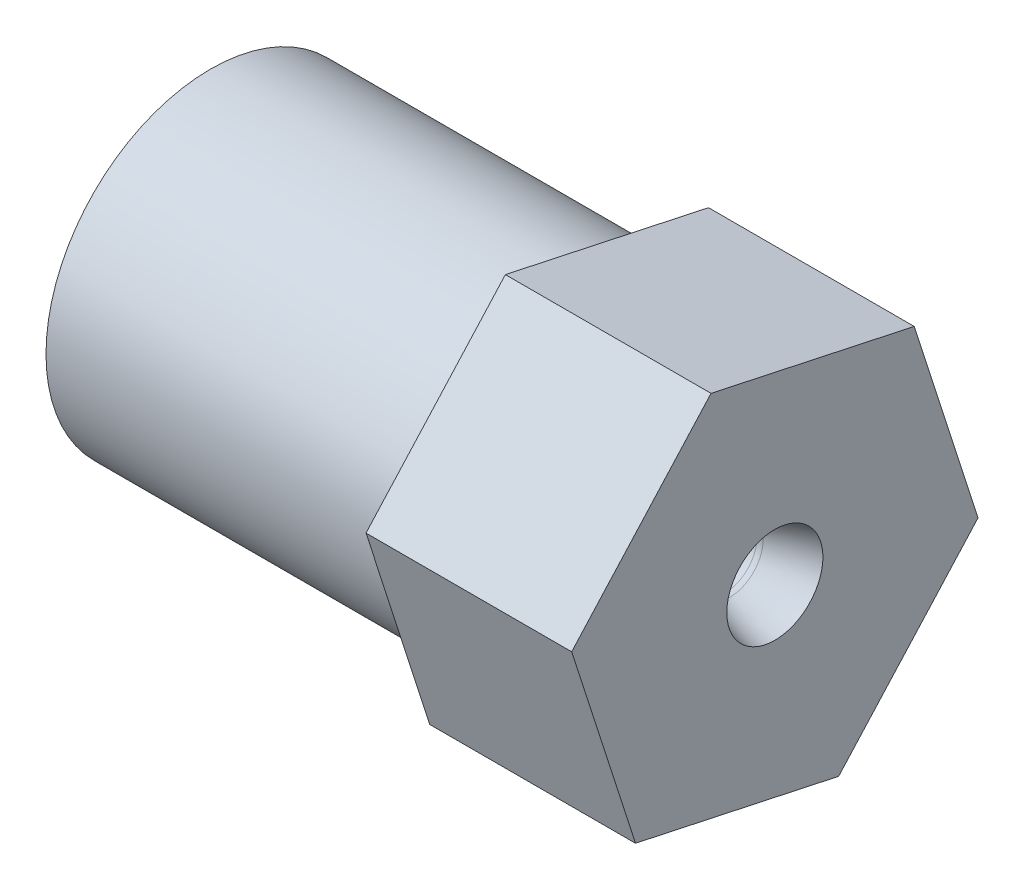
ISO-10303-21;
HEADER;
FILE_DESCRIPTION(('STEP AP214'),'2;1');
FILE_NAME('part.step','',(''),(''),'','','');
FILE_SCHEMA(('AUTOMOTIVE_DESIGN { 1 0 10303 214 1 1 1 1 }'));
ENDSEC;
DATA;
#1=APPLICATION_CONTEXT('core data for automotive mechanical design processes');
#2=APPLICATION_PROTOCOL_DEFINITION('international standard','automotive_design',2000,#1);
#3=PRODUCT_CONTEXT('',#1,'mechanical');
#4=PRODUCT('Part','Part','',(#3));
#5=PRODUCT_RELATED_PRODUCT_CATEGORY('part','',(#4));
#6=PRODUCT_DEFINITION_FORMATION('','',#4);
#7=PRODUCT_DEFINITION_CONTEXT('part definition',#1,'design');
#8=PRODUCT_DEFINITION('design','',#6,#7);
#9=PRODUCT_DEFINITION_SHAPE('','',#8);
#10=(LENGTH_UNIT() NAMED_UNIT(*) SI_UNIT(.MILLI.,.METRE.));
#11=(NAMED_UNIT(*) PLANE_ANGLE_UNIT() SI_UNIT($,.RADIAN.));
#12=(NAMED_UNIT(*) SI_UNIT($,.STERADIAN.) SOLID_ANGLE_UNIT());
#13=UNCERTAINTY_MEASURE_WITH_UNIT(LENGTH_MEASURE(1.E-05),#10,'distance_accuracy_value','');
#14=(GEOMETRIC_REPRESENTATION_CONTEXT(3) GLOBAL_UNCERTAINTY_ASSIGNED_CONTEXT((#13)) GLOBAL_UNIT_ASSIGNED_CONTEXT((#10,
#11,#12)) REPRESENTATION_CONTEXT('',''));
#15=CARTESIAN_POINT('',(0.,0.,0.));
#16=DIRECTION('',(0.,0.,1.));
#17=DIRECTION('',(1.,0.,0.));
#18=AXIS2_PLACEMENT_3D('',#15,#16,#17);
#19=CARTESIAN_POINT('',(0.,0.,0.));
#20=DIRECTION('',(-1.,0.,0.));
#21=DIRECTION('',(0.,0.,1.));
#22=AXIS2_PLACEMENT_3D('',#19,#20,#21);
#23=CYLINDRICAL_SURFACE('',#22,10.16);
#24=CARTESIAN_POINT('',(-10.2372812932457,0.,0.));
#25=DIRECTION('',(1.,0.,0.));
#26=DIRECTION('',(0.,0.,-1.));
#27=AXIS2_PLACEMENT_3D('',#24,#25,#26);
#28=CIRCLE('',#27,10.16);
#29=CARTESIAN_POINT('',(-10.2372812932457,0.,-10.16));
#30=VERTEX_POINT('',#29);
#31=EDGE_CURVE('E11',#30,#30,#28,.F.);
#32=ORIENTED_EDGE('',*,*,#31,.T.);
#33=EDGE_LOOP('',(#32));
#34=FACE_BOUND('',#33,.T.);
#35=CARTESIAN_POINT('',(-31.75,0.,0.));
#36=DIRECTION('',(-1.,0.,0.));
#37=DIRECTION('',(0.,0.,1.));
#38=AXIS2_PLACEMENT_3D('',#35,#36,#37);
#39=CIRCLE('',#38,10.16);
#40=CARTESIAN_POINT('',(-31.75,0.,10.16));
#41=VERTEX_POINT('',#40);
#42=EDGE_CURVE('E225',#41,#41,#39,.T.);
#43=ORIENTED_EDGE('',*,*,#42,.F.);
#44=EDGE_LOOP('',(#43));
#45=FACE_BOUND('',#44,.T.);
#46=ADVANCED_FACE('F37',(#34,#45),#23,.T.);
#47=CARTESIAN_POINT('',(0.,0.,0.));
#48=DIRECTION('',(-1.,0.,0.));
#49=DIRECTION('',(0.,0.,1.));
#50=AXIS2_PLACEMENT_3D('',#47,#48,#49);
#51=TOROIDAL_SURFACE('',#50,5.,3.);
#52=CARTESIAN_POINT('',(0.,0.,0.));
#53=DIRECTION('',(-1.,0.,0.));
#54=DIRECTION('',(0.,0.,1.));
#55=AXIS2_PLACEMENT_3D('',#52,#53,#54);
#56=CIRCLE('',#55,2.00000000000252);
#57=CARTESIAN_POINT('',(0.,0.,2.00000000000252));
#58=VERTEX_POINT('',#57);
#59=EDGE_CURVE('E177',#58,#58,#56,.T.);
#60=ORIENTED_EDGE('',*,*,#59,.F.);
#61=EDGE_LOOP('',(#60));
#62=FACE_BOUND('',#61,.T.);
#63=CARTESIAN_POINT('',(-2.12132034355962,0.,0.));
#64=DIRECTION('',(-1.,0.,0.));
#65=DIRECTION('',(0.,0.,1.));
#66=AXIS2_PLACEMENT_3D('',#63,#64,#65);
#67=CIRCLE('',#66,2.87867965644033);
#68=CARTESIAN_POINT('',(-2.12132034355962,0.,2.87867965644033));
#69=VERTEX_POINT('',#68);
#70=EDGE_CURVE('E142',#69,#69,#67,.T.);
#71=ORIENTED_EDGE('',*,*,#70,.T.);
#72=EDGE_LOOP('',(#71));
#73=FACE_BOUND('',#72,.T.);
#74=ADVANCED_FACE('F166',(#62,#73),#51,.T.);
#75=CARTESIAN_POINT('',(0.,0.,0.));
#76=DIRECTION('',(-1.,0.,0.));
#77=DIRECTION('',(0.,0.,1.));
#78=AXIS2_PLACEMENT_3D('',#75,#76,#77);
#79=TOROIDAL_SURFACE('',#78,2.8,0.799999999997484);
#80=CARTESIAN_POINT('',(0.312584902923518,0.,0.));
#81=DIRECTION('',(-1.,0.,0.));
#82=DIRECTION('',(0.,0.,1.));
#83=AXIS2_PLACEMENT_3D('',#80,#81,#82);
#84=CIRCLE('',#83,2.06359611734608);
#85=CARTESIAN_POINT('',(0.312584902923518,0.,2.06359611734608));
#86=VERTEX_POINT('',#85);
#87=EDGE_CURVE('E231',#86,#86,#84,.T.);
#88=ORIENTED_EDGE('',*,*,#87,.F.);
#89=EDGE_LOOP('',(#88));
#90=FACE_BOUND('',#89,.T.);
#91=ORIENTED_EDGE('',*,*,#59,.T.);
#92=EDGE_LOOP('',(#91));
#93=FACE_BOUND('',#92,.T.);
#94=ADVANCED_FACE('F162',(#90,#93),#79,.T.);
#95=CARTESIAN_POINT('',(385437.078105794,-922750.113604249,0.));
#96=CARTESIAN_POINT('',(-390730.815900652,920506.917050136,0.));
#97=CARTESIAN_POINT('',(396025.804035121,-918255.466111555,0.));
#98=B_SPLINE_CURVE_WITH_KNOTS('',2,(#95,#96,#97),.UNSPECIFIED.,.F.,.F.,(3,3),(0.,1.),.UNSPECIFIED.);
#99=CARTESIAN_POINT('',(0.,0.,0.));
#100=DIRECTION('',(-1.,0.,0.));
#101=AXIS1_PLACEMENT('',#99,#100);
#102=SURFACE_OF_REVOLUTION('',#98,#101);
#103=CARTESIAN_POINT('',(3.09771870675433,0.,0.));
#104=DIRECTION('',(-1.,0.,0.));
#105=DIRECTION('',(0.,0.,1.));
#106=AXIS2_PLACEMENT_3D('',#103,#104,#105);
#107=CIRCLE('',#106,2.96647939483827);
#108=CARTESIAN_POINT('',(3.09771870675433,0.,2.96647939483827));
#109=VERTEX_POINT('',#108);
#110=EDGE_CURVE('E228',#109,#109,#107,.T.);
#111=ORIENTED_EDGE('',*,*,#110,.F.);
#112=EDGE_LOOP('',(#111));
#113=FACE_BOUND('',#112,.T.);
#114=ORIENTED_EDGE('',*,*,#87,.T.);
#115=EDGE_LOOP('',(#114));
#116=FACE_BOUND('',#115,.T.);
#117=ADVANCED_FACE('F157',(#113,#116),#102,.T.);
#118=CARTESIAN_POINT('',(3.09771870675433,10.16,0.));
#119=DIRECTION('',(-1.,0.,0.));
#120=DIRECTION('',(0.,0.,1.));
#121=AXIS2_PLACEMENT_3D('',#118,#119,#120);
#122=PLANE('',#121);
#123=ORIENTED_EDGE('',*,*,#110,.T.);
#124=EDGE_LOOP('',(#123));
#125=FACE_BOUND('',#124,.T.);
#126=DIRECTION('',(0.,-0.951681663898051,-0.307086324345838));
#127=VECTOR('',#126,1.);
#128=CARTESIAN_POINT('',(3.09771870675433,-3.41249677929311,10.575562490067));
#129=LINE('',#128,#127);
#130=CARTESIAN_POINT('',(3.09771870675433,2.69330707117879,12.5457684242006));
#131=VERTEX_POINT('',#130);
#132=CARTESIAN_POINT('',(3.09771870675433,-9.51830062976508,8.60535655593342));
#133=VERTEX_POINT('',#132);
#134=EDGE_CURVE('E125',#131,#133,#129,.T.);
#135=ORIENTED_EDGE('',*,*,#134,.T.);
#136=DIRECTION('',(0.,-0.209896273910743,-0.977723659424475));
#137=VECTOR('',#136,1.);
#138=CARTESIAN_POINT('',(3.09771870675433,-10.8649541653545,2.33247234383313));
#139=LINE('',#138,#137);
#140=CARTESIAN_POINT('',(3.09771870675433,-12.2116077009439,-3.94041186826731));
#141=VERTEX_POINT('',#140);
#142=EDGE_CURVE('E128',#133,#141,#139,.T.);
#143=ORIENTED_EDGE('',*,*,#142,.T.);
#144=DIRECTION('',(0.,0.741785389987309,-0.670637335078637));
#145=VECTOR('',#144,1.);
#146=CARTESIAN_POINT('',(3.09771870675433,-7.45245738606141,-8.24309014623402));
#147=LINE('',#146,#145);
#148=CARTESIAN_POINT('',(3.09771870675433,-2.69330707117886,-12.5457684242008));
#149=VERTEX_POINT('',#148);
#150=EDGE_CURVE('E131',#141,#149,#147,.T.);
#151=ORIENTED_EDGE('',*,*,#150,.T.);
#152=DIRECTION('',(0.,0.951681663898051,0.307086324345838));
#153=VECTOR('',#152,1.);
#154=CARTESIAN_POINT('',(3.09771870675433,3.41249677929314,-10.5755624900671));
#155=LINE('',#154,#153);
#156=CARTESIAN_POINT('',(3.09771870675433,9.51830062976503,-8.60535655593354));
#157=VERTEX_POINT('',#156);
#158=EDGE_CURVE('E134',#149,#157,#155,.T.);
#159=ORIENTED_EDGE('',*,*,#158,.T.);
#160=DIRECTION('',(0.,0.209896273910741,0.977723659424475));
#161=VECTOR('',#160,1.);
#162=CARTESIAN_POINT('',(3.09771870675433,10.8649541653544,-2.3324723438331));
#163=LINE('',#162,#161);
#164=CARTESIAN_POINT('',(3.09771870675433,12.2116077009438,3.94041186826717));
#165=VERTEX_POINT('',#164);
#166=EDGE_CURVE('E102',#157,#165,#163,.T.);
#167=ORIENTED_EDGE('',*,*,#166,.T.);
#168=DIRECTION('',(0.,-0.741785389987308,0.670637335078638));
#169=VECTOR('',#168,1.);
#170=CARTESIAN_POINT('',(3.09771870675433,7.45245738606132,8.2430901462339));
#171=LINE('',#170,#169);
#172=EDGE_CURVE('E137',#165,#131,#171,.T.);
#173=ORIENTED_EDGE('',*,*,#172,.T.);
#174=EDGE_LOOP('',(#135,#143,#151,#159,#167,#173));
#175=FACE_BOUND('',#174,.T.);
#176=ADVANCED_FACE('F161',(#125,#175),#122,.F.);
#177=CARTESIAN_POINT('',(-31.75,10.16,0.));
#178=DIRECTION('',(1.,0.,0.));
#179=DIRECTION('',(0.,0.,-1.));
#180=AXIS2_PLACEMENT_3D('',#177,#178,#179);
#181=PLANE('',#180);
#182=CARTESIAN_POINT('',(-31.75,0.,0.));
#183=DIRECTION('',(-1.,0.,0.));
#184=DIRECTION('',(0.,0.,1.));
#185=AXIS2_PLACEMENT_3D('',#182,#183,#184);
#186=CIRCLE('',#185,8.6614);
#187=CARTESIAN_POINT('',(-31.75,0.,8.6614));
#188=VERTEX_POINT('',#187);
#189=EDGE_CURVE('E222',#188,#188,#186,.T.);
#190=ORIENTED_EDGE('',*,*,#189,.F.);
#191=EDGE_LOOP('',(#190));
#192=FACE_BOUND('',#191,.T.);
#193=ORIENTED_EDGE('',*,*,#42,.T.);
#194=EDGE_LOOP('',(#193));
#195=FACE_BOUND('',#194,.T.);
#196=ADVANCED_FACE('F249',(#192,#195),#181,.F.);
#197=CARTESIAN_POINT('',(-31.115,0.,0.));
#198=DIRECTION('',(-1.,0.,0.));
#199=DIRECTION('',(0.,0.,1.));
#200=AXIS2_PLACEMENT_3D('',#197,#198,#199);
#201=TOROIDAL_SURFACE('',#200,8.6614,0.635);
#202=CARTESIAN_POINT('',(-31.115,0.,0.));
#203=DIRECTION('',(-1.,0.,0.));
#204=DIRECTION('',(0.,0.,1.));
#205=AXIS2_PLACEMENT_3D('',#202,#203,#204);
#206=CIRCLE('',#205,8.02639999999999);
#207=CARTESIAN_POINT('',(-31.115,0.,8.02639999999999));
#208=VERTEX_POINT('',#207);
#209=EDGE_CURVE('E219',#208,#208,#206,.T.);
#210=ORIENTED_EDGE('',*,*,#209,.F.);
#211=EDGE_LOOP('',(#210));
#212=FACE_BOUND('',#211,.T.);
#213=ORIENTED_EDGE('',*,*,#189,.T.);
#214=EDGE_LOOP('',(#213));
#215=FACE_BOUND('',#214,.T.);
#216=ADVANCED_FACE('F251',(#212,#215),#201,.T.);
#217=CARTESIAN_POINT('',(0.,0.,0.));
#218=DIRECTION('',(-1.,0.,0.));
#219=DIRECTION('',(0.,0.,1.));
#220=AXIS2_PLACEMENT_3D('',#217,#218,#219);
#221=CYLINDRICAL_SURFACE('',#220,8.02639999999999);
#222=CARTESIAN_POINT('',(-25.019,0.,0.));
#223=DIRECTION('',(-1.,0.,0.));
#224=DIRECTION('',(0.,0.,1.));
#225=AXIS2_PLACEMENT_3D('',#222,#223,#224);
#226=CIRCLE('',#225,8.02639999999999);
#227=CARTESIAN_POINT('',(-25.019,0.,8.02639999999999));
#228=VERTEX_POINT('',#227);
#229=EDGE_CURVE('E216',#228,#228,#226,.T.);
#230=ORIENTED_EDGE('',*,*,#229,.F.);
#231=EDGE_LOOP('',(#230));
#232=FACE_BOUND('',#231,.T.);
#233=ORIENTED_EDGE('',*,*,#209,.T.);
#234=EDGE_LOOP('',(#233));
#235=FACE_BOUND('',#234,.T.);
#236=ADVANCED_FACE('F258',(#232,#235),#221,.F.);
#237=CARTESIAN_POINT('',(-25.019,0.,0.));
#238=DIRECTION('',(-1.,0.,0.));
#239=DIRECTION('',(0.,0.,1.));
#240=AXIS2_PLACEMENT_3D('',#237,#238,#239);
#241=TOROIDAL_SURFACE('',#240,7.89939999999999,0.127);
#242=CARTESIAN_POINT('',(-24.892,0.,0.));
#243=DIRECTION('',(-1.,0.,0.));
#244=DIRECTION('',(0.,0.,1.));
#245=AXIS2_PLACEMENT_3D('',#242,#243,#244);
#246=CIRCLE('',#245,7.89939999999999);
#247=CARTESIAN_POINT('',(-24.892,0.,7.89939999999999));
#248=VERTEX_POINT('',#247);
#249=EDGE_CURVE('E213',#248,#248,#246,.T.);
#250=ORIENTED_EDGE('',*,*,#249,.F.);
#251=EDGE_LOOP('',(#250));
#252=FACE_BOUND('',#251,.T.);
#253=ORIENTED_EDGE('',*,*,#229,.T.);
#254=EDGE_LOOP('',(#253));
#255=FACE_BOUND('',#254,.T.);
#256=ADVANCED_FACE('F266',(#252,#255),#241,.F.);
#257=CARTESIAN_POINT('',(-24.892,6.9469,0.));
#258=DIRECTION('',(1.,0.,0.));
#259=DIRECTION('',(0.,0.,-1.));
#260=AXIS2_PLACEMENT_3D('',#257,#258,#259);
#261=PLANE('',#260);
#262=CARTESIAN_POINT('',(-24.892,0.,0.));
#263=DIRECTION('',(-1.,0.,0.));
#264=DIRECTION('',(0.,0.,1.));
#265=AXIS2_PLACEMENT_3D('',#262,#263,#264);
#266=CIRCLE('',#265,6.9469);
#267=CARTESIAN_POINT('',(-24.892,0.,6.9469));
#268=VERTEX_POINT('',#267);
#269=EDGE_CURVE('E210',#268,#268,#266,.T.);
#270=ORIENTED_EDGE('',*,*,#269,.F.);
#271=EDGE_LOOP('',(#270));
#272=FACE_BOUND('',#271,.T.);
#273=ORIENTED_EDGE('',*,*,#249,.T.);
#274=EDGE_LOOP('',(#273));
#275=FACE_BOUND('',#274,.T.);
#276=ADVANCED_FACE('F270',(#272,#275),#261,.F.);
#277=CARTESIAN_POINT('',(0.,0.,0.));
#278=DIRECTION('',(-1.,0.,0.));
#279=DIRECTION('',(0.,0.,1.));
#280=AXIS2_PLACEMENT_3D('',#277,#278,#279);
#281=CYLINDRICAL_SURFACE('',#280,6.9469);
#282=CARTESIAN_POINT('',(-20.066,0.,0.));
#283=DIRECTION('',(-1.,0.,0.));
#284=DIRECTION('',(0.,0.,1.));
#285=AXIS2_PLACEMENT_3D('',#282,#283,#284);
#286=CIRCLE('',#285,6.9469);
#287=CARTESIAN_POINT('',(-20.066,0.,6.9469));
#288=VERTEX_POINT('',#287);
#289=EDGE_CURVE('E207',#288,#288,#286,.T.);
#290=ORIENTED_EDGE('',*,*,#289,.F.);
#291=EDGE_LOOP('',(#290));
#292=FACE_BOUND('',#291,.T.);
#293=ORIENTED_EDGE('',*,*,#269,.T.);
#294=EDGE_LOOP('',(#293));
#295=FACE_BOUND('',#294,.T.);
#296=ADVANCED_FACE('F274',(#292,#295),#281,.F.);
#297=CARTESIAN_POINT('',(-20.066,0.,0.));
#298=DIRECTION('',(-1.,0.,0.));
#299=DIRECTION('',(0.,0.,1.));
#300=AXIS2_PLACEMENT_3D('',#297,#298,#299);
#301=TOROIDAL_SURFACE('',#300,6.8199,0.127);
#302=CARTESIAN_POINT('',(-19.939,0.,0.));
#303=DIRECTION('',(-1.,0.,0.));
#304=DIRECTION('',(0.,0.,1.));
#305=AXIS2_PLACEMENT_3D('',#302,#303,#304);
#306=CIRCLE('',#305,6.8199);
#307=CARTESIAN_POINT('',(-19.939,0.,6.8199));
#308=VERTEX_POINT('',#307);
#309=EDGE_CURVE('E204',#308,#308,#306,.T.);
#310=ORIENTED_EDGE('',*,*,#309,.F.);
#311=EDGE_LOOP('',(#310));
#312=FACE_BOUND('',#311,.T.);
#313=ORIENTED_EDGE('',*,*,#289,.T.);
#314=EDGE_LOOP('',(#313));
#315=FACE_BOUND('',#314,.T.);
#316=ADVANCED_FACE('F278',(#312,#315),#301,.F.);
#317=CARTESIAN_POINT('',(-19.939,5.46100000000001,0.));
#318=DIRECTION('',(1.,0.,0.));
#319=DIRECTION('',(0.,0.,-1.));
#320=AXIS2_PLACEMENT_3D('',#317,#318,#319);
#321=PLANE('',#320);
#322=CARTESIAN_POINT('',(-19.939,0.,0.));
#323=DIRECTION('',(-1.,0.,0.));
#324=DIRECTION('',(0.,0.,1.));
#325=AXIS2_PLACEMENT_3D('',#322,#323,#324);
#326=CIRCLE('',#325,5.46100000000001);
#327=CARTESIAN_POINT('',(-19.939,0.,5.46100000000001));
#328=VERTEX_POINT('',#327);
#329=EDGE_CURVE('E201',#328,#328,#326,.T.);
#330=ORIENTED_EDGE('',*,*,#329,.F.);
#331=EDGE_LOOP('',(#330));
#332=FACE_BOUND('',#331,.T.);
#333=ORIENTED_EDGE('',*,*,#309,.T.);
#334=EDGE_LOOP('',(#333));
#335=FACE_BOUND('',#334,.T.);
#336=ADVANCED_FACE('F282',(#332,#335),#321,.F.);
#337=CARTESIAN_POINT('',(-19.304,0.,0.));
#338=DIRECTION('',(-1.,0.,0.));
#339=DIRECTION('',(0.,0.,1.));
#340=AXIS2_PLACEMENT_3D('',#337,#338,#339);
#341=TOROIDAL_SURFACE('',#340,5.461,0.635);
#342=CARTESIAN_POINT('',(-19.304,0.,0.));
#343=DIRECTION('',(-1.,0.,0.));
#344=DIRECTION('',(0.,0.,1.));
#345=AXIS2_PLACEMENT_3D('',#342,#343,#344);
#346=CIRCLE('',#345,4.826);
#347=CARTESIAN_POINT('',(-19.304,0.,4.826));
#348=VERTEX_POINT('',#347);
#349=EDGE_CURVE('E198',#348,#348,#346,.T.);
#350=ORIENTED_EDGE('',*,*,#349,.F.);
#351=EDGE_LOOP('',(#350));
#352=FACE_BOUND('',#351,.T.);
#353=ORIENTED_EDGE('',*,*,#329,.T.);
#354=EDGE_LOOP('',(#353));
#355=FACE_BOUND('',#354,.T.);
#356=ADVANCED_FACE('F286',(#352,#355),#341,.T.);
#357=CARTESIAN_POINT('',(0.,0.,0.));
#358=DIRECTION('',(-1.,0.,0.));
#359=DIRECTION('',(0.,0.,1.));
#360=AXIS2_PLACEMENT_3D('',#357,#358,#359);
#361=CYLINDRICAL_SURFACE('',#360,4.826);
#362=CARTESIAN_POINT('',(-13.589,0.,0.));
#363=DIRECTION('',(-1.,0.,0.));
#364=DIRECTION('',(0.,0.,1.));
#365=AXIS2_PLACEMENT_3D('',#362,#363,#364);
#366=CIRCLE('',#365,4.826);
#367=CARTESIAN_POINT('',(-13.589,0.,4.826));
#368=VERTEX_POINT('',#367);
#369=EDGE_CURVE('E195',#368,#368,#366,.T.);
#370=ORIENTED_EDGE('',*,*,#369,.F.);
#371=EDGE_LOOP('',(#370));
#372=FACE_BOUND('',#371,.T.);
#373=ORIENTED_EDGE('',*,*,#349,.T.);
#374=EDGE_LOOP('',(#373));
#375=FACE_BOUND('',#374,.T.);
#376=ADVANCED_FACE('F290',(#372,#375),#361,.F.);
#377=CARTESIAN_POINT('',(-13.589,0.,0.));
#378=DIRECTION('',(-1.,0.,0.));
#379=DIRECTION('',(0.,0.,1.));
#380=AXIS2_PLACEMENT_3D('',#377,#378,#379);
#381=TOROIDAL_SURFACE('',#380,4.699,0.127);
#382=CARTESIAN_POINT('',(-13.462,0.,0.));
#383=DIRECTION('',(-1.,0.,0.));
#384=DIRECTION('',(0.,0.,1.));
#385=AXIS2_PLACEMENT_3D('',#382,#383,#384);
#386=CIRCLE('',#385,4.699);
#387=CARTESIAN_POINT('',(-13.462,0.,4.699));
#388=VERTEX_POINT('',#387);
#389=EDGE_CURVE('E192',#388,#388,#386,.T.);
#390=ORIENTED_EDGE('',*,*,#389,.F.);
#391=EDGE_LOOP('',(#390));
#392=FACE_BOUND('',#391,.T.);
#393=ORIENTED_EDGE('',*,*,#369,.T.);
#394=EDGE_LOOP('',(#393));
#395=FACE_BOUND('',#394,.T.);
#396=ADVANCED_FACE('F294',(#392,#395),#381,.F.);
#397=CARTESIAN_POINT('',(-13.462,4.445,0.));
#398=DIRECTION('',(1.,0.,0.));
#399=DIRECTION('',(0.,0.,-1.));
#400=AXIS2_PLACEMENT_3D('',#397,#398,#399);
#401=PLANE('',#400);
#402=CARTESIAN_POINT('',(-13.462,0.,0.));
#403=DIRECTION('',(-1.,0.,0.));
#404=DIRECTION('',(0.,0.,1.));
#405=AXIS2_PLACEMENT_3D('',#402,#403,#404);
#406=CIRCLE('',#405,4.445);
#407=CARTESIAN_POINT('',(-13.462,0.,4.445));
#408=VERTEX_POINT('',#407);
#409=EDGE_CURVE('E187',#408,#408,#406,.T.);
#410=ORIENTED_EDGE('',*,*,#409,.F.);
#411=EDGE_LOOP('',(#410));
#412=FACE_BOUND('',#411,.T.);
#413=ORIENTED_EDGE('',*,*,#389,.T.);
#414=EDGE_LOOP('',(#413));
#415=FACE_BOUND('',#414,.T.);
#416=ADVANCED_FACE('F298',(#412,#415),#401,.F.);
#417=CARTESIAN_POINT('',(0.,0.,0.));
#418=DIRECTION('',(-1.,0.,0.));
#419=DIRECTION('',(0.,0.,1.));
#420=AXIS2_PLACEMENT_3D('',#417,#418,#419);
#421=CYLINDRICAL_SURFACE('',#420,4.445);
#422=CARTESIAN_POINT('',(-5.00276874765388,0.,0.));
#423=DIRECTION('',(-1.,0.,0.));
#424=DIRECTION('',(0.,0.,1.));
#425=AXIS2_PLACEMENT_3D('',#422,#423,#424);
#426=CIRCLE('',#425,4.445);
#427=CARTESIAN_POINT('',(-5.00276874765388,0.,4.445));
#428=VERTEX_POINT('',#427);
#429=EDGE_CURVE('E183',#428,#428,#426,.T.);
#430=ORIENTED_EDGE('',*,*,#429,.F.);
#431=EDGE_LOOP('',(#430));
#432=FACE_BOUND('',#431,.T.);
#433=ORIENTED_EDGE('',*,*,#409,.T.);
#434=EDGE_LOOP('',(#433));
#435=FACE_BOUND('',#434,.T.);
#436=ADVANCED_FACE('F302',(#432,#435),#421,.F.);
#437=CARTESIAN_POINT('',(-5.00276874765387,0.,0.));
#438=DIRECTION('',(-1.,0.,0.));
#439=DIRECTION('',(0.,0.,1.));
#440=AXIS2_PLACEMENT_3D('',#437,#438,#439);
#441=DEGENERATE_TOROIDAL_SURFACE('',#440,1.27,3.175,.T.);
#442=CARTESIAN_POINT('',(-2.75770471738661,0.,0.));
#443=DIRECTION('',(-1.,0.,0.));
#444=DIRECTION('',(0.,0.,1.));
#445=AXIS2_PLACEMENT_3D('',#442,#443,#444);
#446=CIRCLE('',#445,3.51506403026731);
#447=CARTESIAN_POINT('',(-2.75770471738661,0.,3.51506403026731));
#448=VERTEX_POINT('',#447);
#449=EDGE_CURVE('E181',#448,#448,#446,.T.);
#450=ORIENTED_EDGE('',*,*,#449,.F.);
#451=EDGE_LOOP('',(#450));
#452=FACE_BOUND('',#451,.T.);
#453=ORIENTED_EDGE('',*,*,#429,.T.);
#454=EDGE_LOOP('',(#453));
#455=FACE_BOUND('',#454,.T.);
#456=ADVANCED_FACE('F306',(#452,#455),#441,.F.);
#457=CARTESIAN_POINT('',(-2.75770471738661,0.,0.));
#458=DIRECTION('',(-1.,0.,0.));
#459=DIRECTION('',(0.,0.,1.));
#460=AXIS2_PLACEMENT_3D('',#457,#458,#459);
#461=CONICAL_SURFACE('',#460,3.51506403026731,0.785398163397435);
#462=ORIENTED_EDGE('',*,*,#70,.F.);
#463=EDGE_LOOP('',(#462));
#464=FACE_BOUND('',#463,.T.);
#465=ORIENTED_EDGE('',*,*,#449,.T.);
#466=EDGE_LOOP('',(#465));
#467=FACE_BOUND('',#466,.T.);
#468=ADVANCED_FACE('F310',(#464,#467),#461,.F.);
#469=CARTESIAN_POINT('',(-9.60228129324567,-3.41249677929311,10.575562490067));
#470=DIRECTION('',(0.,-0.307086324345838,0.951681663898051));
#471=DIRECTION('',(0.,-0.951681663898051,-0.307086324345838));
#472=AXIS2_PLACEMENT_3D('',#469,#470,#471);
#473=PLANE('',#472);
#474=ORIENTED_EDGE('',*,*,#134,.F.);
#475=DIRECTION('',(1.,0.,0.));
#476=VECTOR('',#475,1.);
#477=CARTESIAN_POINT('',(-9.60228129324567,2.69330707117879,12.5457684242006));
#478=LINE('',#477,#476);
#479=CARTESIAN_POINT('',(-9.60228129324567,2.69330707117879,12.5457684242006));
#480=VERTEX_POINT('',#479);
#481=EDGE_CURVE('E54',#480,#131,#478,.T.);
#482=ORIENTED_EDGE('',*,*,#481,.F.);
#483=DIRECTION('',(0.,-0.951681663898051,-0.307086324345838));
#484=VECTOR('',#483,1.);
#485=CARTESIAN_POINT('',(-9.60228129324567,-3.41249677929311,10.575562490067));
#486=LINE('',#485,#484);
#487=CARTESIAN_POINT('',(-9.60228129324567,-9.51830062976508,8.60535655593342));
#488=VERTEX_POINT('',#487);
#489=EDGE_CURVE('E140',#480,#488,#486,.T.);
#490=ORIENTED_EDGE('',*,*,#489,.T.);
#491=DIRECTION('',(1.,0.,0.));
#492=VECTOR('',#491,1.);
#493=CARTESIAN_POINT('',(-9.60228129324567,-9.51830062976508,8.60535655593342));
#494=LINE('',#493,#492);
#495=EDGE_CURVE('E89',#488,#133,#494,.T.);
#496=ORIENTED_EDGE('',*,*,#495,.T.);
#497=EDGE_LOOP('',(#474,#482,#490,#496));
#498=FACE_BOUND('',#497,.T.);
#499=ADVANCED_FACE('F314',(#498),#473,.T.);
#500=CARTESIAN_POINT('',(-9.60228129324567,7.45245738606132,8.2430901462339));
#501=DIRECTION('',(0.,0.670637335078638,0.741785389987308));
#502=DIRECTION('',(0.,-0.741785389987308,0.670637335078638));
#503=AXIS2_PLACEMENT_3D('',#500,#501,#502);
#504=PLANE('',#503);
#505=ORIENTED_EDGE('',*,*,#172,.F.);
#506=DIRECTION('',(1.,0.,0.));
#507=VECTOR('',#506,1.);
#508=CARTESIAN_POINT('',(-9.60228129324567,12.2116077009438,3.94041186826717));
#509=LINE('',#508,#507);
#510=CARTESIAN_POINT('',(-9.60228129324567,12.2116077009438,3.94041186826717));
#511=VERTEX_POINT('',#510);
#512=EDGE_CURVE('E77',#511,#165,#509,.T.);
#513=ORIENTED_EDGE('',*,*,#512,.F.);
#514=DIRECTION('',(0.,-0.741785389987308,0.670637335078638));
#515=VECTOR('',#514,1.);
#516=CARTESIAN_POINT('',(-9.60228129324567,7.45245738606132,8.2430901462339));
#517=LINE('',#516,#515);
#518=EDGE_CURVE('E115',#511,#480,#517,.T.);
#519=ORIENTED_EDGE('',*,*,#518,.T.);
#520=ORIENTED_EDGE('',*,*,#481,.T.);
#521=EDGE_LOOP('',(#505,#513,#519,#520));
#522=FACE_BOUND('',#521,.T.);
#523=ADVANCED_FACE('F317',(#522),#504,.T.);
#524=CARTESIAN_POINT('',(-9.60228129324567,10.8649541653544,-2.3324723438331));
#525=DIRECTION('',(0.,0.977723659424475,-0.209896273910741));
#526=DIRECTION('',(0.,0.209896273910741,0.977723659424475));
#527=AXIS2_PLACEMENT_3D('',#524,#525,#526);
#528=PLANE('',#527);
#529=ORIENTED_EDGE('',*,*,#166,.F.);
#530=DIRECTION('',(1.,0.,0.));
#531=VECTOR('',#530,1.);
#532=CARTESIAN_POINT('',(-9.60228129324567,9.51830062976503,-8.60535655593354));
#533=LINE('',#532,#531);
#534=CARTESIAN_POINT('',(-9.60228129324567,9.51830062976503,-8.60535655593354));
#535=VERTEX_POINT('',#534);
#536=EDGE_CURVE('E97',#535,#157,#533,.T.);
#537=ORIENTED_EDGE('',*,*,#536,.F.);
#538=DIRECTION('',(0.,0.209896273910741,0.977723659424475));
#539=VECTOR('',#538,1.);
#540=CARTESIAN_POINT('',(-9.60228129324567,10.8649541653544,-2.3324723438331));
#541=LINE('',#540,#539);
#542=EDGE_CURVE('E100',#535,#511,#541,.T.);
#543=ORIENTED_EDGE('',*,*,#542,.T.);
#544=ORIENTED_EDGE('',*,*,#512,.T.);
#545=EDGE_LOOP('',(#529,#537,#543,#544));
#546=FACE_BOUND('',#545,.T.);
#547=ADVANCED_FACE('F99',(#546),#528,.T.);
#548=CARTESIAN_POINT('',(-9.60228129324567,3.41249677929314,-10.5755624900671));
#549=DIRECTION('',(0.,0.307086324345838,-0.951681663898051));
#550=DIRECTION('',(0.,0.951681663898051,0.307086324345838));
#551=AXIS2_PLACEMENT_3D('',#548,#549,#550);
#552=PLANE('',#551);
#553=ORIENTED_EDGE('',*,*,#158,.F.);
#554=DIRECTION('',(1.,0.,0.));
#555=VECTOR('',#554,1.);
#556=CARTESIAN_POINT('',(-9.60228129324567,-2.69330707117886,-12.5457684242008));
#557=LINE('',#556,#555);
#558=CARTESIAN_POINT('',(-9.60228129324567,-2.69330707117886,-12.5457684242008));
#559=VERTEX_POINT('',#558);
#560=EDGE_CURVE('E107',#559,#149,#557,.T.);
#561=ORIENTED_EDGE('',*,*,#560,.F.);
#562=DIRECTION('',(0.,0.951681663898051,0.307086324345838));
#563=VECTOR('',#562,1.);
#564=CARTESIAN_POINT('',(-9.60228129324567,3.41249677929314,-10.5755624900671));
#565=LINE('',#564,#563);
#566=EDGE_CURVE('E113',#559,#535,#565,.T.);
#567=ORIENTED_EDGE('',*,*,#566,.T.);
#568=ORIENTED_EDGE('',*,*,#536,.T.);
#569=EDGE_LOOP('',(#553,#561,#567,#568));
#570=FACE_BOUND('',#569,.T.);
#571=ADVANCED_FACE('F117',(#570),#552,.T.);
#572=CARTESIAN_POINT('',(-9.60228129324567,-7.45245738606141,-8.24309014623402));
#573=DIRECTION('',(0.,-0.670637335078637,-0.741785389987309));
#574=DIRECTION('',(0.,0.741785389987309,-0.670637335078637));
#575=AXIS2_PLACEMENT_3D('',#572,#573,#574);
#576=PLANE('',#575);
#577=ORIENTED_EDGE('',*,*,#150,.F.);
#578=DIRECTION('',(1.,0.,0.));
#579=VECTOR('',#578,1.);
#580=CARTESIAN_POINT('',(-9.60228129324567,-12.2116077009439,-3.94041186826731));
#581=LINE('',#580,#579);
#582=CARTESIAN_POINT('',(-9.60228129324567,-12.2116077009439,-3.94041186826731));
#583=VERTEX_POINT('',#582);
#584=EDGE_CURVE('E145',#583,#141,#581,.T.);
#585=ORIENTED_EDGE('',*,*,#584,.F.);
#586=DIRECTION('',(0.,0.741785389987309,-0.670637335078637));
#587=VECTOR('',#586,1.);
#588=CARTESIAN_POINT('',(-9.60228129324567,-7.45245738606141,-8.24309014623402));
#589=LINE('',#588,#587);
#590=EDGE_CURVE('E118',#583,#559,#589,.T.);
#591=ORIENTED_EDGE('',*,*,#590,.T.);
#592=ORIENTED_EDGE('',*,*,#560,.T.);
#593=EDGE_LOOP('',(#577,#585,#591,#592));
#594=FACE_BOUND('',#593,.T.);
#595=ADVANCED_FACE('F320',(#594),#576,.T.);
#596=CARTESIAN_POINT('',(-9.60228129324567,-10.8649541653545,2.33247234383313));
#597=DIRECTION('',(0.,-0.977723659424475,0.209896273910743));
#598=DIRECTION('',(0.,-0.209896273910743,-0.977723659424475));
#599=AXIS2_PLACEMENT_3D('',#596,#597,#598);
#600=PLANE('',#599);
#601=ORIENTED_EDGE('',*,*,#142,.F.);
#602=ORIENTED_EDGE('',*,*,#495,.F.);
#603=DIRECTION('',(0.,-0.209896273910743,-0.977723659424475));
#604=VECTOR('',#603,1.);
#605=CARTESIAN_POINT('',(-9.60228129324567,-10.8649541653545,2.33247234383313));
#606=LINE('',#605,#604);
#607=EDGE_CURVE('E120',#488,#583,#606,.T.);
#608=ORIENTED_EDGE('',*,*,#607,.T.);
#609=ORIENTED_EDGE('',*,*,#584,.T.);
#610=EDGE_LOOP('',(#601,#602,#608,#609));
#611=FACE_BOUND('',#610,.T.);
#612=ADVANCED_FACE('F243',(#611),#600,.T.);
#613=CARTESIAN_POINT('',(-9.60228129324567,0.,0.));
#614=DIRECTION('',(1.,0.,0.));
#615=DIRECTION('',(0.,0.,-1.));
#616=AXIS2_PLACEMENT_3D('',#613,#614,#615);
#617=PLANE('',#616);
#618=CARTESIAN_POINT('',(-9.60228129324567,0.,0.));
#619=DIRECTION('',(1.,0.,0.));
#620=DIRECTION('',(0.,0.,-1.));
#621=AXIS2_PLACEMENT_3D('',#618,#619,#620);
#622=CIRCLE('',#621,10.795);
#623=CARTESIAN_POINT('',(-9.60228129324567,0.,-10.795));
#624=VERTEX_POINT('',#623);
#625=EDGE_CURVE('E46',#624,#624,#622,.T.);
#626=ORIENTED_EDGE('',*,*,#625,.T.);
#627=EDGE_LOOP('',(#626));
#628=FACE_BOUND('',#627,.T.);
#629=ORIENTED_EDGE('',*,*,#489,.F.);
#630=ORIENTED_EDGE('',*,*,#518,.F.);
#631=ORIENTED_EDGE('',*,*,#542,.F.);
#632=ORIENTED_EDGE('',*,*,#566,.F.);
#633=ORIENTED_EDGE('',*,*,#590,.F.);
#634=ORIENTED_EDGE('',*,*,#607,.F.);
#635=EDGE_LOOP('',(#629,#630,#631,#632,#633,#634));
#636=FACE_BOUND('',#635,.T.);
#637=ADVANCED_FACE('F111',(#628,#636),#617,.F.);
#638=CARTESIAN_POINT('',(-10.2372812932457,0.,0.));
#639=DIRECTION('',(1.,0.,0.));
#640=DIRECTION('',(0.,0.,-1.));
#641=AXIS2_PLACEMENT_3D('',#638,#639,#640);
#642=TOROIDAL_SURFACE('',#641,10.795,0.635);
#643=ORIENTED_EDGE('',*,*,#31,.F.);
#644=EDGE_LOOP('',(#643));
#645=FACE_BOUND('',#644,.T.);
#646=ORIENTED_EDGE('',*,*,#625,.F.);
#647=EDGE_LOOP('',(#646));
#648=FACE_BOUND('',#647,.T.);
#649=ADVANCED_FACE('F39',(#645,#648),#642,.F.);
#650=CLOSED_SHELL('',(#46,#74,#94,#117,#176,#196,#216,#236,#256,#276,#296,#316,#336,#356,#376,
#396,#416,#436,#456,#468,#499,#523,#547,#571,#595,#612,#637,#649));
#651=MANIFOLD_SOLID_BREP('B2',#650);
#652=ADVANCED_BREP_SHAPE_REPRESENTATION('',(#18,#651),#14);
#653=SHAPE_DEFINITION_REPRESENTATION(#9,#652);
ENDSEC;
END-ISO-10303-21;
